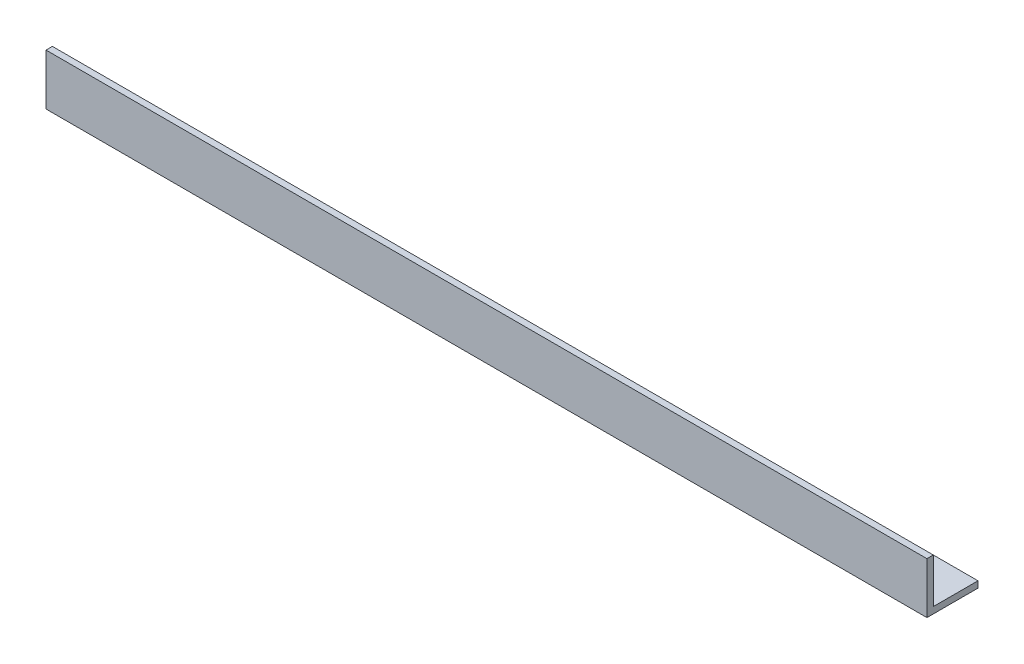
ISO-10303-21;
HEADER;
FILE_DESCRIPTION(('STEP AP214'),'2;1');
FILE_NAME('part.step','',(''),(''),'','','');
FILE_SCHEMA(('AUTOMOTIVE_DESIGN { 1 0 10303 214 1 1 1 1 }'));
ENDSEC;
DATA;
#1=APPLICATION_CONTEXT('core data for automotive mechanical design processes');
#2=APPLICATION_PROTOCOL_DEFINITION('international standard','automotive_design',2000,#1);
#3=PRODUCT_CONTEXT('',#1,'mechanical');
#4=PRODUCT('Part','Part','',(#3));
#5=PRODUCT_RELATED_PRODUCT_CATEGORY('part','',(#4));
#6=PRODUCT_DEFINITION_FORMATION('','',#4);
#7=PRODUCT_DEFINITION_CONTEXT('part definition',#1,'design');
#8=PRODUCT_DEFINITION('design','',#6,#7);
#9=PRODUCT_DEFINITION_SHAPE('','',#8);
#10=(LENGTH_UNIT() NAMED_UNIT(*) SI_UNIT(.MILLI.,.METRE.));
#11=(NAMED_UNIT(*) PLANE_ANGLE_UNIT() SI_UNIT($,.RADIAN.));
#12=(NAMED_UNIT(*) SI_UNIT($,.STERADIAN.) SOLID_ANGLE_UNIT());
#13=UNCERTAINTY_MEASURE_WITH_UNIT(LENGTH_MEASURE(1.E-05),#10,'distance_accuracy_value','');
#14=(GEOMETRIC_REPRESENTATION_CONTEXT(3) GLOBAL_UNCERTAINTY_ASSIGNED_CONTEXT((#13)) GLOBAL_UNIT_ASSIGNED_CONTEXT((#10,
#11,#12)) REPRESENTATION_CONTEXT('',''));
#15=CARTESIAN_POINT('',(0.,0.,0.));
#16=DIRECTION('',(0.,0.,1.));
#17=DIRECTION('',(1.,0.,0.));
#18=AXIS2_PLACEMENT_3D('',#15,#16,#17);
#19=CARTESIAN_POINT('',(219.075,0.,-12.7));
#20=DIRECTION('',(0.,1.,0.));
#21=DIRECTION('',(0.,0.,1.));
#22=AXIS2_PLACEMENT_3D('',#19,#20,#21);
#23=PLANE('',#22);
#24=DIRECTION('',(0.,0.,-1.));
#25=VECTOR('',#24,1.);
#26=CARTESIAN_POINT('',(0.,0.,-12.7));
#27=LINE('',#26,#25);
#28=CARTESIAN_POINT('',(0.,0.,0.));
#29=VERTEX_POINT('',#28);
#30=CARTESIAN_POINT('',(0.,0.,-12.7));
#31=VERTEX_POINT('',#30);
#32=EDGE_CURVE('E117',#29,#31,#27,.T.);
#33=ORIENTED_EDGE('',*,*,#32,.T.);
#34=DIRECTION('',(-1.,0.,0.));
#35=VECTOR('',#34,1.);
#36=CARTESIAN_POINT('',(219.075,0.,-12.7));
#37=LINE('',#36,#35);
#38=CARTESIAN_POINT('',(219.075,0.,-12.7));
#39=VERTEX_POINT('',#38);
#40=EDGE_CURVE('E11',#39,#31,#37,.T.);
#41=ORIENTED_EDGE('',*,*,#40,.F.);
#42=DIRECTION('',(0.,0.,-1.));
#43=VECTOR('',#42,1.);
#44=CARTESIAN_POINT('',(219.075,0.,-12.7));
#45=LINE('',#44,#43);
#46=CARTESIAN_POINT('',(219.075,0.,0.));
#47=VERTEX_POINT('',#46);
#48=EDGE_CURVE('E127',#47,#39,#45,.T.);
#49=ORIENTED_EDGE('',*,*,#48,.F.);
#50=DIRECTION('',(-1.,0.,0.));
#51=VECTOR('',#50,1.);
#52=CARTESIAN_POINT('',(219.075,0.,0.));
#53=LINE('',#52,#51);
#54=EDGE_CURVE('E113',#47,#29,#53,.T.);
#55=ORIENTED_EDGE('',*,*,#54,.T.);
#56=EDGE_LOOP('',(#33,#41,#49,#55));
#57=FACE_BOUND('',#56,.T.);
#58=ADVANCED_FACE('F33',(#57),#23,.F.);
#59=CARTESIAN_POINT('',(219.075,1.5875,-12.7));
#60=DIRECTION('',(0.,0.,1.));
#61=DIRECTION('',(0.,-1.,0.));
#62=AXIS2_PLACEMENT_3D('',#59,#60,#61);
#63=PLANE('',#62);
#64=DIRECTION('',(0.,1.,0.));
#65=VECTOR('',#64,1.);
#66=CARTESIAN_POINT('',(0.,1.5875,-12.7));
#67=LINE('',#66,#65);
#68=CARTESIAN_POINT('',(0.,1.5875,-12.7));
#69=VERTEX_POINT('',#68);
#70=EDGE_CURVE('E120',#31,#69,#67,.T.);
#71=ORIENTED_EDGE('',*,*,#70,.T.);
#72=DIRECTION('',(-1.,0.,0.));
#73=VECTOR('',#72,1.);
#74=CARTESIAN_POINT('',(219.075,1.5875,-12.7));
#75=LINE('',#74,#73);
#76=CARTESIAN_POINT('',(219.075,1.5875,-12.7));
#77=VERTEX_POINT('',#76);
#78=EDGE_CURVE('E41',#77,#69,#75,.T.);
#79=ORIENTED_EDGE('',*,*,#78,.F.);
#80=DIRECTION('',(0.,1.,0.));
#81=VECTOR('',#80,1.);
#82=CARTESIAN_POINT('',(219.075,1.5875,-12.7));
#83=LINE('',#82,#81);
#84=EDGE_CURVE('E86',#39,#77,#83,.T.);
#85=ORIENTED_EDGE('',*,*,#84,.F.);
#86=ORIENTED_EDGE('',*,*,#40,.T.);
#87=EDGE_LOOP('',(#71,#79,#85,#86));
#88=FACE_BOUND('',#87,.T.);
#89=ADVANCED_FACE('F151',(#88),#63,.F.);
#90=CARTESIAN_POINT('',(219.075,1.5875,-1.5875));
#91=DIRECTION('',(0.,-1.,0.));
#92=DIRECTION('',(0.,0.,-1.));
#93=AXIS2_PLACEMENT_3D('',#90,#91,#92);
#94=PLANE('',#93);
#95=DIRECTION('',(0.,0.,1.));
#96=VECTOR('',#95,1.);
#97=CARTESIAN_POINT('',(0.,1.5875,-1.5875));
#98=LINE('',#97,#96);
#99=CARTESIAN_POINT('',(0.,1.5875,-1.5875));
#100=VERTEX_POINT('',#99);
#101=EDGE_CURVE('E122',#69,#100,#98,.T.);
#102=ORIENTED_EDGE('',*,*,#101,.T.);
#103=DIRECTION('',(-1.,0.,0.));
#104=VECTOR('',#103,1.);
#105=CARTESIAN_POINT('',(219.075,1.5875,-1.5875));
#106=LINE('',#105,#104);
#107=CARTESIAN_POINT('',(219.075,1.5875,-1.5875));
#108=VERTEX_POINT('',#107);
#109=EDGE_CURVE('E108',#108,#100,#106,.T.);
#110=ORIENTED_EDGE('',*,*,#109,.F.);
#111=DIRECTION('',(0.,0.,1.));
#112=VECTOR('',#111,1.);
#113=CARTESIAN_POINT('',(219.075,1.5875,-1.5875));
#114=LINE('',#113,#112);
#115=EDGE_CURVE('E99',#77,#108,#114,.T.);
#116=ORIENTED_EDGE('',*,*,#115,.F.);
#117=ORIENTED_EDGE('',*,*,#78,.T.);
#118=EDGE_LOOP('',(#102,#110,#116,#117));
#119=FACE_BOUND('',#118,.T.);
#120=ADVANCED_FACE('F133',(#119),#94,.F.);
#121=CARTESIAN_POINT('',(219.075,12.7,-1.5875));
#122=DIRECTION('',(0.,0.,1.));
#123=DIRECTION('',(0.,-1.,0.));
#124=AXIS2_PLACEMENT_3D('',#121,#122,#123);
#125=PLANE('',#124);
#126=DIRECTION('',(0.,1.,0.));
#127=VECTOR('',#126,1.);
#128=CARTESIAN_POINT('',(0.,12.7,-1.5875));
#129=LINE('',#128,#127);
#130=CARTESIAN_POINT('',(0.,12.7,-1.5875));
#131=VERTEX_POINT('',#130);
#132=EDGE_CURVE('E107',#100,#131,#129,.T.);
#133=ORIENTED_EDGE('',*,*,#132,.T.);
#134=DIRECTION('',(-1.,0.,0.));
#135=VECTOR('',#134,1.);
#136=CARTESIAN_POINT('',(219.075,12.7,-1.5875));
#137=LINE('',#136,#135);
#138=CARTESIAN_POINT('',(219.075,12.7,-1.5875));
#139=VERTEX_POINT('',#138);
#140=EDGE_CURVE('E104',#139,#131,#137,.T.);
#141=ORIENTED_EDGE('',*,*,#140,.F.);
#142=DIRECTION('',(0.,1.,0.));
#143=VECTOR('',#142,1.);
#144=CARTESIAN_POINT('',(219.075,12.7,-1.5875));
#145=LINE('',#144,#143);
#146=EDGE_CURVE('E93',#108,#139,#145,.T.);
#147=ORIENTED_EDGE('',*,*,#146,.F.);
#148=ORIENTED_EDGE('',*,*,#109,.T.);
#149=EDGE_LOOP('',(#133,#141,#147,#148));
#150=FACE_BOUND('',#149,.T.);
#151=ADVANCED_FACE('F105',(#150),#125,.F.);
#152=CARTESIAN_POINT('',(219.075,12.7,0.));
#153=DIRECTION('',(0.,-1.,0.));
#154=DIRECTION('',(0.,0.,-1.));
#155=AXIS2_PLACEMENT_3D('',#152,#153,#154);
#156=PLANE('',#155);
#157=DIRECTION('',(0.,0.,1.));
#158=VECTOR('',#157,1.);
#159=CARTESIAN_POINT('',(0.,12.7,0.));
#160=LINE('',#159,#158);
#161=CARTESIAN_POINT('',(0.,12.7,0.));
#162=VERTEX_POINT('',#161);
#163=EDGE_CURVE('E72',#131,#162,#160,.T.);
#164=ORIENTED_EDGE('',*,*,#163,.T.);
#165=DIRECTION('',(-1.,0.,0.));
#166=VECTOR('',#165,1.);
#167=CARTESIAN_POINT('',(219.075,12.7,0.));
#168=LINE('',#167,#166);
#169=CARTESIAN_POINT('',(219.075,12.7,0.));
#170=VERTEX_POINT('',#169);
#171=EDGE_CURVE('E109',#170,#162,#168,.T.);
#172=ORIENTED_EDGE('',*,*,#171,.F.);
#173=DIRECTION('',(0.,0.,1.));
#174=VECTOR('',#173,1.);
#175=CARTESIAN_POINT('',(219.075,12.7,0.));
#176=LINE('',#175,#174);
#177=EDGE_CURVE('E97',#139,#170,#176,.T.);
#178=ORIENTED_EDGE('',*,*,#177,.F.);
#179=ORIENTED_EDGE('',*,*,#140,.T.);
#180=EDGE_LOOP('',(#164,#172,#178,#179));
#181=FACE_BOUND('',#180,.T.);
#182=ADVANCED_FACE('F111',(#181),#156,.F.);
#183=CARTESIAN_POINT('',(219.075,0.,0.));
#184=DIRECTION('',(0.,0.,-1.));
#185=DIRECTION('',(-1.,0.,0.));
#186=AXIS2_PLACEMENT_3D('',#183,#184,#185);
#187=PLANE('',#186);
#188=DIRECTION('',(0.,-1.,0.));
#189=VECTOR('',#188,1.);
#190=CARTESIAN_POINT('',(0.,0.,0.));
#191=LINE('',#190,#189);
#192=EDGE_CURVE('E78',#162,#29,#191,.T.);
#193=ORIENTED_EDGE('',*,*,#192,.T.);
#194=ORIENTED_EDGE('',*,*,#54,.F.);
#195=DIRECTION('',(0.,-1.,0.));
#196=VECTOR('',#195,1.);
#197=CARTESIAN_POINT('',(219.075,0.,0.));
#198=LINE('',#197,#196);
#199=EDGE_CURVE('E49',#170,#47,#198,.T.);
#200=ORIENTED_EDGE('',*,*,#199,.F.);
#201=ORIENTED_EDGE('',*,*,#171,.T.);
#202=EDGE_LOOP('',(#193,#194,#200,#201));
#203=FACE_BOUND('',#202,.T.);
#204=ADVANCED_FACE('F140',(#203),#187,.F.);
#205=CARTESIAN_POINT('',(219.075,0.,0.));
#206=DIRECTION('',(-1.,0.,0.));
#207=DIRECTION('',(0.,0.,1.));
#208=AXIS2_PLACEMENT_3D('',#205,#206,#207);
#209=PLANE('',#208);
#210=ORIENTED_EDGE('',*,*,#48,.T.);
#211=ORIENTED_EDGE('',*,*,#84,.T.);
#212=ORIENTED_EDGE('',*,*,#115,.T.);
#213=ORIENTED_EDGE('',*,*,#146,.T.);
#214=ORIENTED_EDGE('',*,*,#177,.T.);
#215=ORIENTED_EDGE('',*,*,#199,.T.);
#216=EDGE_LOOP('',(#210,#211,#212,#213,#214,#215));
#217=FACE_BOUND('',#216,.T.);
#218=ADVANCED_FACE('F95',(#217),#209,.F.);
#219=CARTESIAN_POINT('',(0.,0.,0.));
#220=DIRECTION('',(-1.,0.,0.));
#221=DIRECTION('',(0.,0.,1.));
#222=AXIS2_PLACEMENT_3D('',#219,#220,#221);
#223=PLANE('',#222);
#224=ORIENTED_EDGE('',*,*,#32,.F.);
#225=ORIENTED_EDGE('',*,*,#192,.F.);
#226=ORIENTED_EDGE('',*,*,#163,.F.);
#227=ORIENTED_EDGE('',*,*,#132,.F.);
#228=ORIENTED_EDGE('',*,*,#101,.F.);
#229=ORIENTED_EDGE('',*,*,#70,.F.);
#230=EDGE_LOOP('',(#224,#225,#226,#227,#228,#229));
#231=FACE_BOUND('',#230,.T.);
#232=ADVANCED_FACE('F136',(#231),#223,.T.);
#233=CLOSED_SHELL('',(#58,#89,#120,#151,#182,#204,#218,#232));
#234=MANIFOLD_SOLID_BREP('B2',#233);
#235=ADVANCED_BREP_SHAPE_REPRESENTATION('',(#18,#234),#14);
#236=SHAPE_DEFINITION_REPRESENTATION(#9,#235);
ENDSEC;
END-ISO-10303-21;
